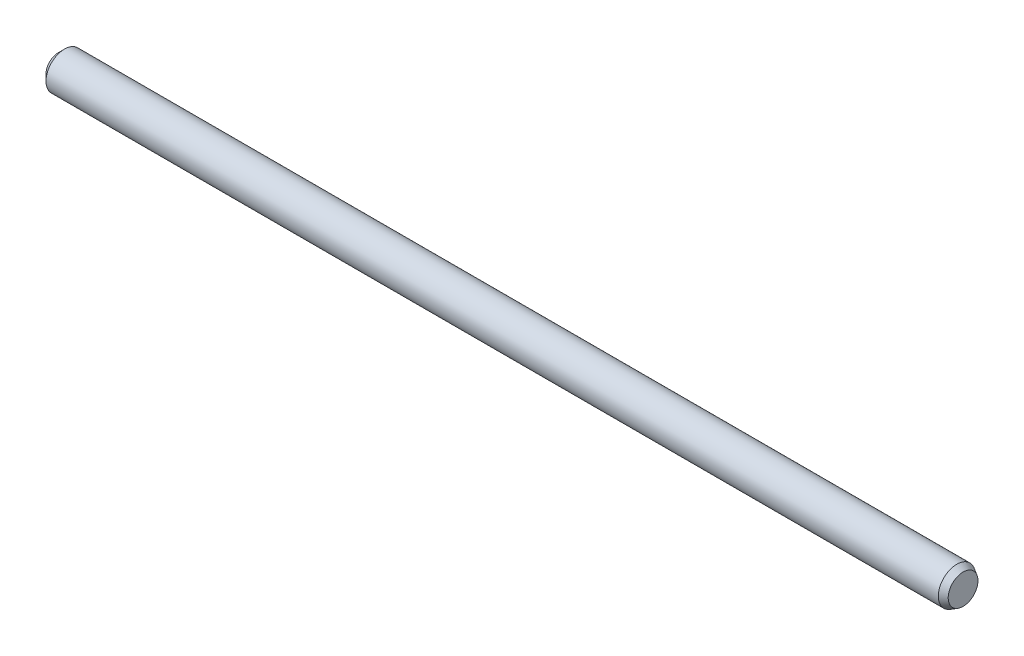
ISO-10303-21;
HEADER;
FILE_DESCRIPTION(('STEP AP214'),'2;1');
FILE_NAME('part.step','',(''),(''),'','','');
FILE_SCHEMA(('AUTOMOTIVE_DESIGN { 1 0 10303 214 1 1 1 1 }'));
ENDSEC;
DATA;
#1=APPLICATION_CONTEXT('core data for automotive mechanical design processes');
#2=APPLICATION_PROTOCOL_DEFINITION('international standard','automotive_design',2000,#1);
#3=PRODUCT_CONTEXT('',#1,'mechanical');
#4=PRODUCT('Part','Part','',(#3));
#5=PRODUCT_RELATED_PRODUCT_CATEGORY('part','',(#4));
#6=PRODUCT_DEFINITION_FORMATION('','',#4);
#7=PRODUCT_DEFINITION_CONTEXT('part definition',#1,'design');
#8=PRODUCT_DEFINITION('design','',#6,#7);
#9=PRODUCT_DEFINITION_SHAPE('','',#8);
#10=(LENGTH_UNIT() NAMED_UNIT(*) SI_UNIT(.MILLI.,.METRE.));
#11=(NAMED_UNIT(*) PLANE_ANGLE_UNIT() SI_UNIT($,.RADIAN.));
#12=(NAMED_UNIT(*) SI_UNIT($,.STERADIAN.) SOLID_ANGLE_UNIT());
#13=UNCERTAINTY_MEASURE_WITH_UNIT(LENGTH_MEASURE(1.E-05),#10,'distance_accuracy_value','');
#14=(GEOMETRIC_REPRESENTATION_CONTEXT(3) GLOBAL_UNCERTAINTY_ASSIGNED_CONTEXT((#13)) GLOBAL_UNIT_ASSIGNED_CONTEXT((#10,
#11,#12)) REPRESENTATION_CONTEXT('',''));
#15=CARTESIAN_POINT('',(0.,0.,0.));
#16=DIRECTION('',(0.,0.,1.));
#17=DIRECTION('',(1.,0.,0.));
#18=AXIS2_PLACEMENT_3D('',#15,#16,#17);
#19=CARTESIAN_POINT('',(72.,0.,0.));
#20=DIRECTION('',(-1.,0.,0.));
#21=DIRECTION('',(0.,0.,1.));
#22=AXIS2_PLACEMENT_3D('',#19,#20,#21);
#23=CYLINDRICAL_SURFACE('',#22,1.475);
#24=CARTESIAN_POINT('',(0.5,0.,0.));
#25=DIRECTION('',(1.,0.,0.));
#26=DIRECTION('',(0.,0.,-1.));
#27=AXIS2_PLACEMENT_3D('',#24,#25,#26);
#28=CIRCLE('',#27,1.475);
#29=CARTESIAN_POINT('',(0.5,0.,-1.475));
#30=VERTEX_POINT('',#29);
#31=EDGE_CURVE('E40',#30,#30,#28,.T.);
#32=ORIENTED_EDGE('',*,*,#31,.T.);
#33=EDGE_LOOP('',(#32));
#34=FACE_BOUND('',#33,.T.);
#35=CARTESIAN_POINT('',(71.5,0.,0.));
#36=DIRECTION('',(1.,0.,0.));
#37=DIRECTION('',(0.,0.,-1.));
#38=AXIS2_PLACEMENT_3D('',#35,#36,#37);
#39=CIRCLE('',#38,1.475);
#40=CARTESIAN_POINT('',(71.5,0.,-1.475));
#41=VERTEX_POINT('',#40);
#42=EDGE_CURVE('E44',#41,#41,#39,.F.);
#43=ORIENTED_EDGE('',*,*,#42,.T.);
#44=EDGE_LOOP('',(#43));
#45=FACE_BOUND('',#44,.T.);
#46=ADVANCED_FACE('F33',(#34,#45),#23,.T.);
#47=CARTESIAN_POINT('',(72.,0.,0.));
#48=DIRECTION('',(1.,0.,0.));
#49=DIRECTION('',(0.,0.,-1.));
#50=AXIS2_PLACEMENT_3D('',#47,#48,#49);
#51=PLANE('',#50);
#52=CARTESIAN_POINT('',(72.,0.,0.));
#53=DIRECTION('',(1.,0.,0.));
#54=DIRECTION('',(0.,0.,-1.));
#55=AXIS2_PLACEMENT_3D('',#52,#53,#54);
#56=CIRCLE('',#55,1.18632486540518);
#57=CARTESIAN_POINT('',(72.,0.,-1.18632486540518));
#58=VERTEX_POINT('',#57);
#59=EDGE_CURVE('E48',#58,#58,#56,.T.);
#60=ORIENTED_EDGE('',*,*,#59,.T.);
#61=EDGE_LOOP('',(#60));
#62=FACE_BOUND('',#61,.T.);
#63=ADVANCED_FACE('F54',(#62),#51,.T.);
#64=CARTESIAN_POINT('',(0.,0.,0.));
#65=DIRECTION('',(1.,0.,0.));
#66=DIRECTION('',(0.,0.,-1.));
#67=AXIS2_PLACEMENT_3D('',#64,#65,#66);
#68=PLANE('',#67);
#69=CARTESIAN_POINT('',(0.,0.,0.));
#70=DIRECTION('',(1.,0.,0.));
#71=DIRECTION('',(0.,0.,-1.));
#72=AXIS2_PLACEMENT_3D('',#69,#70,#71);
#73=CIRCLE('',#72,0.97499999999999);
#74=CARTESIAN_POINT('',(0.,0.,-0.97499999999999));
#75=VERTEX_POINT('',#74);
#76=EDGE_CURVE('E10',#75,#75,#73,.F.);
#77=ORIENTED_EDGE('',*,*,#76,.T.);
#78=EDGE_LOOP('',(#77));
#79=FACE_BOUND('',#78,.T.);
#80=ADVANCED_FACE('F58',(#79),#68,.F.);
#81=CARTESIAN_POINT('',(72.,0.,0.));
#82=DIRECTION('',(-1.,0.,0.));
#83=DIRECTION('',(0.,0.,1.));
#84=AXIS2_PLACEMENT_3D('',#81,#82,#83);
#85=CONICAL_SURFACE('',#84,1.18632486540518,0.523598775598297);
#86=ORIENTED_EDGE('',*,*,#42,.F.);
#87=EDGE_LOOP('',(#86));
#88=FACE_BOUND('',#87,.T.);
#89=ORIENTED_EDGE('',*,*,#59,.F.);
#90=EDGE_LOOP('',(#89));
#91=FACE_BOUND('',#90,.T.);
#92=ADVANCED_FACE('F56',(#88,#91),#85,.T.);
#93=CARTESIAN_POINT('',(0.5,0.,0.));
#94=DIRECTION('',(1.,0.,0.));
#95=DIRECTION('',(0.,0.,-1.));
#96=AXIS2_PLACEMENT_3D('',#93,#94,#95);
#97=CONICAL_SURFACE('',#96,1.475,0.785398163397458);
#98=ORIENTED_EDGE('',*,*,#76,.F.);
#99=EDGE_LOOP('',(#98));
#100=FACE_BOUND('',#99,.T.);
#101=ORIENTED_EDGE('',*,*,#31,.F.);
#102=EDGE_LOOP('',(#101));
#103=FACE_BOUND('',#102,.T.);
#104=ADVANCED_FACE('F35',(#100,#103),#97,.T.);
#105=CLOSED_SHELL('',(#46,#63,#80,#92,#104));
#106=MANIFOLD_SOLID_BREP('B2',#105);
#107=ADVANCED_BREP_SHAPE_REPRESENTATION('',(#18,#106),#14);
#108=SHAPE_DEFINITION_REPRESENTATION(#9,#107);
ENDSEC;
END-ISO-10303-21;
